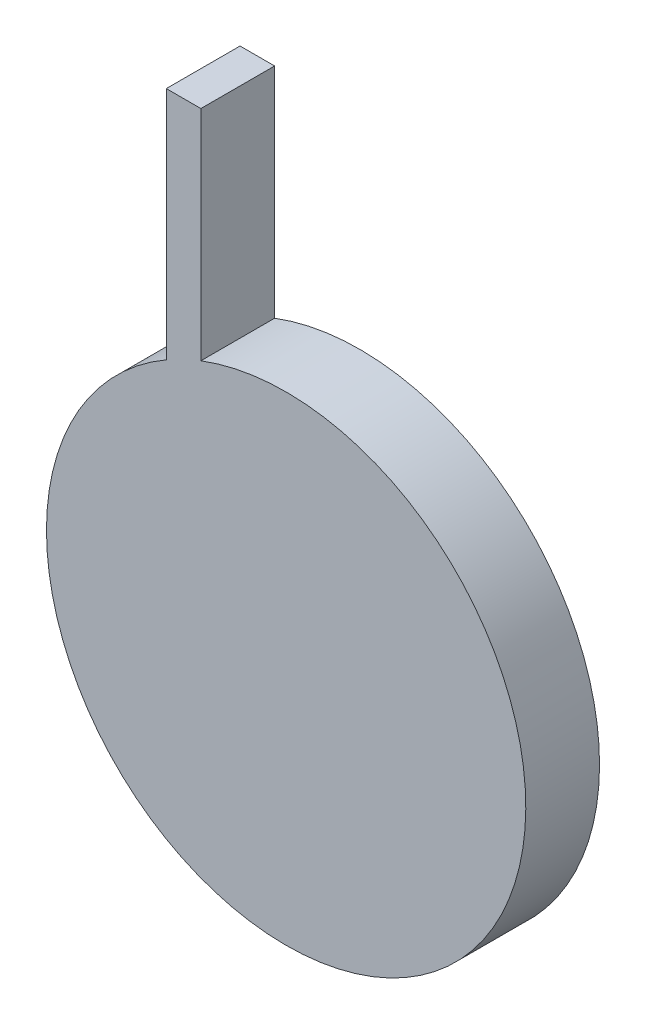
ISO-10303-21;
HEADER;
FILE_DESCRIPTION(('STEP AP214'),'2;1');
FILE_NAME('part.step','',(''),(''),'','','');
FILE_SCHEMA(('AUTOMOTIVE_DESIGN { 1 0 10303 214 1 1 1 1 }'));
ENDSEC;
DATA;
#1=APPLICATION_CONTEXT('core data for automotive mechanical design processes');
#2=APPLICATION_PROTOCOL_DEFINITION('international standard','automotive_design',2000,#1);
#3=PRODUCT_CONTEXT('',#1,'mechanical');
#4=PRODUCT('Part','Part','',(#3));
#5=PRODUCT_RELATED_PRODUCT_CATEGORY('part','',(#4));
#6=PRODUCT_DEFINITION_FORMATION('','',#4);
#7=PRODUCT_DEFINITION_CONTEXT('part definition',#1,'design');
#8=PRODUCT_DEFINITION('design','',#6,#7);
#9=PRODUCT_DEFINITION_SHAPE('','',#8);
#10=(LENGTH_UNIT() NAMED_UNIT(*) SI_UNIT(.MILLI.,.METRE.));
#11=(NAMED_UNIT(*) PLANE_ANGLE_UNIT() SI_UNIT($,.RADIAN.));
#12=(NAMED_UNIT(*) SI_UNIT($,.STERADIAN.) SOLID_ANGLE_UNIT());
#13=UNCERTAINTY_MEASURE_WITH_UNIT(LENGTH_MEASURE(1.E-05),#10,'distance_accuracy_value','');
#14=(GEOMETRIC_REPRESENTATION_CONTEXT(3) GLOBAL_UNCERTAINTY_ASSIGNED_CONTEXT((#13)) GLOBAL_UNIT_ASSIGNED_CONTEXT((#10,
#11,#12)) REPRESENTATION_CONTEXT('',''));
#15=CARTESIAN_POINT('',(0.,0.,0.));
#16=DIRECTION('',(0.,0.,1.));
#17=DIRECTION('',(1.,0.,0.));
#18=AXIS2_PLACEMENT_3D('',#15,#16,#17);
#19=CARTESIAN_POINT('',(0.,0.,8.));
#20=DIRECTION('',(0.,0.,-1.));
#21=DIRECTION('',(-1.,0.,0.));
#22=AXIS2_PLACEMENT_3D('',#19,#20,#21);
#23=CYLINDRICAL_SURFACE('',#22,26.);
#24=DIRECTION('',(0.,0.,-1.));
#25=VECTOR('',#24,1.);
#26=CARTESIAN_POINT('',(-13.,22.5166604983954,8.));
#27=LINE('',#26,#25);
#28=CARTESIAN_POINT('',(-13.,22.5166604983954,0.));
#29=VERTEX_POINT('',#28);
#30=CARTESIAN_POINT('',(-13.,22.5166604983954,8.));
#31=VERTEX_POINT('',#30);
#32=EDGE_CURVE('E109',#29,#31,#27,.F.);
#33=ORIENTED_EDGE('',*,*,#32,.F.);
#34=CARTESIAN_POINT('',(0.,0.,0.));
#35=DIRECTION('',(0.,0.,1.));
#36=DIRECTION('',(1.,0.,0.));
#37=AXIS2_PLACEMENT_3D('',#34,#35,#36);
#38=CIRCLE('',#37,26.);
#39=CARTESIAN_POINT('',(-9.25,24.2989197290744,0.));
#40=VERTEX_POINT('',#39);
#41=EDGE_CURVE('E42',#29,#40,#38,.T.);
#42=ORIENTED_EDGE('',*,*,#41,.T.);
#43=DIRECTION('',(0.,0.,-1.));
#44=VECTOR('',#43,1.);
#45=CARTESIAN_POINT('',(-9.25,24.2989197290744,8.));
#46=LINE('',#45,#44);
#47=CARTESIAN_POINT('',(-9.25,24.2989197290744,8.));
#48=VERTEX_POINT('',#47);
#49=EDGE_CURVE('E59',#48,#40,#46,.T.);
#50=ORIENTED_EDGE('',*,*,#49,.F.);
#51=CARTESIAN_POINT('',(0.,0.,8.));
#52=DIRECTION('',(0.,0.,1.));
#53=DIRECTION('',(1.,0.,0.));
#54=AXIS2_PLACEMENT_3D('',#51,#52,#53);
#55=CIRCLE('',#54,26.);
#56=EDGE_CURVE('E11',#31,#48,#55,.T.);
#57=ORIENTED_EDGE('',*,*,#56,.F.);
#58=EDGE_LOOP('',(#33,#42,#50,#57));
#59=FACE_BOUND('',#58,.T.);
#60=ADVANCED_FACE('F41',(#59),#23,.T.);
#61=CARTESIAN_POINT('',(0.,0.,8.));
#62=DIRECTION('',(0.,0.,1.));
#63=DIRECTION('',(1.,0.,0.));
#64=AXIS2_PLACEMENT_3D('',#61,#62,#63);
#65=PLANE('',#64);
#66=ORIENTED_EDGE('',*,*,#56,.T.);
#67=DIRECTION('',(0.,1.,0.));
#68=VECTOR('',#67,1.);
#69=CARTESIAN_POINT('',(-9.25,20.,8.));
#70=LINE('',#69,#68);
#71=CARTESIAN_POINT('',(-9.25,48.,8.));
#72=VERTEX_POINT('',#71);
#73=EDGE_CURVE('E77',#48,#72,#70,.T.);
#74=ORIENTED_EDGE('',*,*,#73,.T.);
#75=DIRECTION('',(-1.,0.,0.));
#76=VECTOR('',#75,1.);
#77=CARTESIAN_POINT('',(-13.,48.,8.));
#78=LINE('',#77,#76);
#79=CARTESIAN_POINT('',(-13.,48.,8.));
#80=VERTEX_POINT('',#79);
#81=EDGE_CURVE('E81',#72,#80,#78,.T.);
#82=ORIENTED_EDGE('',*,*,#81,.T.);
#83=DIRECTION('',(0.,-1.,0.));
#84=VECTOR('',#83,1.);
#85=CARTESIAN_POINT('',(-13.,20.,8.));
#86=LINE('',#85,#84);
#87=EDGE_CURVE('E83',#80,#31,#86,.T.);
#88=ORIENTED_EDGE('',*,*,#87,.T.);
#89=EDGE_LOOP('',(#66,#74,#82,#88));
#90=FACE_BOUND('',#89,.T.);
#91=ADVANCED_FACE('F76',(#90),#65,.T.);
#92=CARTESIAN_POINT('',(0.,0.,0.));
#93=DIRECTION('',(0.,0.,1.));
#94=DIRECTION('',(1.,0.,0.));
#95=AXIS2_PLACEMENT_3D('',#92,#93,#94);
#96=PLANE('',#95);
#97=CARTESIAN_POINT('',(-11.25,45.5,0.));
#98=DIRECTION('',(0.,0.,-1.));
#99=DIRECTION('',(-1.,0.,0.));
#100=AXIS2_PLACEMENT_3D('',#97,#98,#99);
#101=CIRCLE('',#100,1.);
#102=CARTESIAN_POINT('',(-12.25,45.5,0.));
#103=VERTEX_POINT('',#102);
#104=EDGE_CURVE('E117',#103,#103,#101,.T.);
#105=ORIENTED_EDGE('',*,*,#104,.F.);
#106=EDGE_LOOP('',(#105));
#107=FACE_BOUND('',#106,.T.);
#108=ORIENTED_EDGE('',*,*,#41,.F.);
#109=DIRECTION('',(0.,-1.,0.));
#110=VECTOR('',#109,1.);
#111=CARTESIAN_POINT('',(-13.,20.,0.));
#112=LINE('',#111,#110);
#113=CARTESIAN_POINT('',(-13.,48.,0.));
#114=VERTEX_POINT('',#113);
#115=EDGE_CURVE('E105',#114,#29,#112,.T.);
#116=ORIENTED_EDGE('',*,*,#115,.F.);
#117=DIRECTION('',(-1.,0.,0.));
#118=VECTOR('',#117,1.);
#119=CARTESIAN_POINT('',(-13.,48.,0.));
#120=LINE('',#119,#118);
#121=CARTESIAN_POINT('',(-9.25,48.,0.));
#122=VERTEX_POINT('',#121);
#123=EDGE_CURVE('E110',#122,#114,#120,.T.);
#124=ORIENTED_EDGE('',*,*,#123,.F.);
#125=DIRECTION('',(0.,1.,0.));
#126=VECTOR('',#125,1.);
#127=CARTESIAN_POINT('',(-9.25,20.,0.));
#128=LINE('',#127,#126);
#129=EDGE_CURVE('E90',#40,#122,#128,.T.);
#130=ORIENTED_EDGE('',*,*,#129,.F.);
#131=EDGE_LOOP('',(#108,#116,#124,#130));
#132=FACE_BOUND('',#131,.T.);
#133=ADVANCED_FACE('F114',(#107,#132),#96,.F.);
#134=CARTESIAN_POINT('',(-13.,20.,8.));
#135=DIRECTION('',(1.,0.,0.));
#136=DIRECTION('',(0.,0.,-1.));
#137=AXIS2_PLACEMENT_3D('',#134,#135,#136);
#138=PLANE('',#137);
#139=ORIENTED_EDGE('',*,*,#115,.T.);
#140=ORIENTED_EDGE('',*,*,#32,.T.);
#141=ORIENTED_EDGE('',*,*,#87,.F.);
#142=DIRECTION('',(0.,0.,-1.));
#143=VECTOR('',#142,1.);
#144=CARTESIAN_POINT('',(-13.,48.,8.));
#145=LINE('',#144,#143);
#146=EDGE_CURVE('E93',#80,#114,#145,.T.);
#147=ORIENTED_EDGE('',*,*,#146,.T.);
#148=EDGE_LOOP('',(#139,#140,#141,#147));
#149=FACE_BOUND('',#148,.T.);
#150=ADVANCED_FACE('F116',(#149),#138,.F.);
#151=CARTESIAN_POINT('',(-9.25,20.,8.));
#152=DIRECTION('',(-1.,0.,0.));
#153=DIRECTION('',(0.,0.,1.));
#154=AXIS2_PLACEMENT_3D('',#151,#152,#153);
#155=PLANE('',#154);
#156=ORIENTED_EDGE('',*,*,#73,.F.);
#157=ORIENTED_EDGE('',*,*,#49,.T.);
#158=ORIENTED_EDGE('',*,*,#129,.T.);
#159=DIRECTION('',(0.,0.,-1.));
#160=VECTOR('',#159,1.);
#161=CARTESIAN_POINT('',(-9.25,48.,8.));
#162=LINE('',#161,#160);
#163=EDGE_CURVE('E87',#72,#122,#162,.T.);
#164=ORIENTED_EDGE('',*,*,#163,.F.);
#165=EDGE_LOOP('',(#156,#157,#158,#164));
#166=FACE_BOUND('',#165,.T.);
#167=ADVANCED_FACE('F89',(#166),#155,.F.);
#168=CARTESIAN_POINT('',(-13.,48.,8.));
#169=DIRECTION('',(0.,-1.,0.));
#170=DIRECTION('',(0.,0.,-1.));
#171=AXIS2_PLACEMENT_3D('',#168,#169,#170);
#172=PLANE('',#171);
#173=ORIENTED_EDGE('',*,*,#123,.T.);
#174=ORIENTED_EDGE('',*,*,#146,.F.);
#175=ORIENTED_EDGE('',*,*,#81,.F.);
#176=ORIENTED_EDGE('',*,*,#163,.T.);
#177=EDGE_LOOP('',(#173,#174,#175,#176));
#178=FACE_BOUND('',#177,.T.);
#179=ADVANCED_FACE('F94',(#178),#172,.F.);
#180=CARTESIAN_POINT('',(-11.25,45.5,4.5));
#181=DIRECTION('',(0.,0.,-1.));
#182=DIRECTION('',(-1.,0.,0.));
#183=AXIS2_PLACEMENT_3D('',#180,#181,#182);
#184=CYLINDRICAL_SURFACE('',#183,1.);
#185=CARTESIAN_POINT('',(-11.25,45.5,4.5));
#186=DIRECTION('',(0.,0.,-1.));
#187=DIRECTION('',(-1.,0.,0.));
#188=AXIS2_PLACEMENT_3D('',#185,#186,#187);
#189=CIRCLE('',#188,1.);
#190=CARTESIAN_POINT('',(-12.25,45.5,4.5));
#191=VERTEX_POINT('',#190);
#192=EDGE_CURVE('E102',#191,#191,#189,.T.);
#193=ORIENTED_EDGE('',*,*,#192,.F.);
#194=EDGE_LOOP('',(#193));
#195=FACE_BOUND('',#194,.T.);
#196=ORIENTED_EDGE('',*,*,#104,.T.);
#197=EDGE_LOOP('',(#196));
#198=FACE_BOUND('',#197,.T.);
#199=ADVANCED_FACE('F126',(#195,#198),#184,.F.);
#200=CARTESIAN_POINT('',(-11.25,45.5,4.5));
#201=DIRECTION('',(0.,0.,-1.));
#202=DIRECTION('',(-1.,0.,0.));
#203=AXIS2_PLACEMENT_3D('',#200,#201,#202);
#204=PLANE('',#203);
#205=ORIENTED_EDGE('',*,*,#192,.T.);
#206=EDGE_LOOP('',(#205));
#207=FACE_BOUND('',#206,.T.);
#208=ADVANCED_FACE('F121',(#207),#204,.T.);
#209=CLOSED_SHELL('',(#60,#91,#133,#150,#167,#179,#199,#208));
#210=MANIFOLD_SOLID_BREP('B2',#209);
#211=ADVANCED_BREP_SHAPE_REPRESENTATION('',(#18,#210),#14);
#212=SHAPE_DEFINITION_REPRESENTATION(#9,#211);
ENDSEC;
END-ISO-10303-21;
